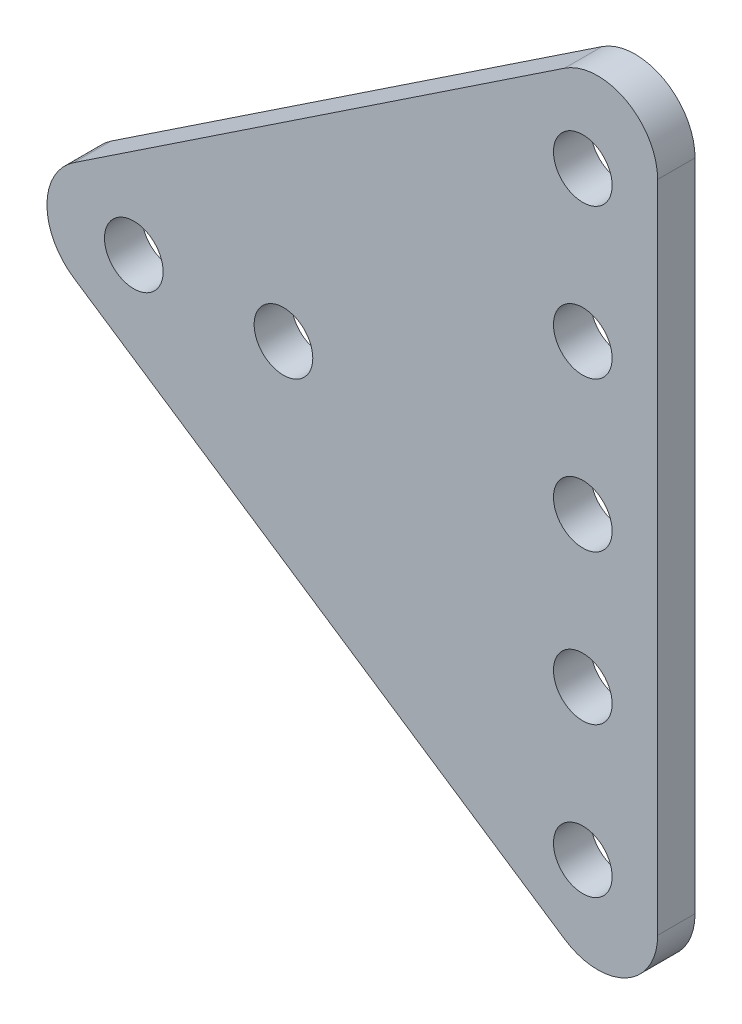
ISO-10303-21;
HEADER;
FILE_DESCRIPTION(('STEP AP214'),'2;1');
FILE_NAME('part.step','',(''),(''),'','','');
FILE_SCHEMA(('AUTOMOTIVE_DESIGN { 1 0 10303 214 1 1 1 1 }'));
ENDSEC;
DATA;
#1=APPLICATION_CONTEXT('core data for automotive mechanical design processes');
#2=APPLICATION_PROTOCOL_DEFINITION('international standard','automotive_design',2000,#1);
#3=PRODUCT_CONTEXT('',#1,'mechanical');
#4=PRODUCT('Part','Part','',(#3));
#5=PRODUCT_RELATED_PRODUCT_CATEGORY('part','',(#4));
#6=PRODUCT_DEFINITION_FORMATION('','',#4);
#7=PRODUCT_DEFINITION_CONTEXT('part definition',#1,'design');
#8=PRODUCT_DEFINITION('design','',#6,#7);
#9=PRODUCT_DEFINITION_SHAPE('','',#8);
#10=(LENGTH_UNIT() NAMED_UNIT(*) SI_UNIT(.MILLI.,.METRE.));
#11=(NAMED_UNIT(*) PLANE_ANGLE_UNIT() SI_UNIT($,.RADIAN.));
#12=(NAMED_UNIT(*) SI_UNIT($,.STERADIAN.) SOLID_ANGLE_UNIT());
#13=UNCERTAINTY_MEASURE_WITH_UNIT(LENGTH_MEASURE(1.E-05),#10,'distance_accuracy_value','');
#14=(GEOMETRIC_REPRESENTATION_CONTEXT(3) GLOBAL_UNCERTAINTY_ASSIGNED_CONTEXT((#13)) GLOBAL_UNIT_ASSIGNED_CONTEXT((#10,
#11,#12)) REPRESENTATION_CONTEXT('',''));
#15=CARTESIAN_POINT('',(0.,0.,0.));
#16=DIRECTION('',(0.,0.,1.));
#17=DIRECTION('',(1.,0.,0.));
#18=AXIS2_PLACEMENT_3D('',#15,#16,#17);
#19=CARTESIAN_POINT('',(336.55,-114.3,123.825));
#20=DIRECTION('',(1.,0.,0.));
#21=DIRECTION('',(0.,0.,-1.));
#22=AXIS2_PLACEMENT_3D('',#19,#20,#21);
#23=PLANE('',#22);
#24=DIRECTION('',(0.,-1.,0.));
#25=VECTOR('',#24,1.);
#26=CARTESIAN_POINT('',(336.55,-114.3,123.825));
#27=LINE('',#26,#25);
#28=CARTESIAN_POINT('',(336.55,-86.5269829206469,123.825));
#29=VERTEX_POINT('',#28);
#30=CARTESIAN_POINT('',(336.55,-142.073017079353,123.825));
#31=VERTEX_POINT('',#30);
#32=EDGE_CURVE('E96',#29,#31,#27,.T.);
#33=ORIENTED_EDGE('',*,*,#32,.T.);
#34=DIRECTION('',(0.,0.,-1.));
#35=VECTOR('',#34,1.);
#36=CARTESIAN_POINT('',(336.55,-142.073017079353,120.65));
#37=LINE('',#36,#35);
#38=CARTESIAN_POINT('',(336.55,-142.073017079353,120.65));
#39=VERTEX_POINT('',#38);
#40=EDGE_CURVE('E108',#31,#39,#37,.T.);
#41=ORIENTED_EDGE('',*,*,#40,.T.);
#42=DIRECTION('',(0.,-1.,0.));
#43=VECTOR('',#42,1.);
#44=CARTESIAN_POINT('',(336.55,-114.3,120.65));
#45=LINE('',#44,#43);
#46=CARTESIAN_POINT('',(336.55,-86.5269829206469,120.65));
#47=VERTEX_POINT('',#46);
#48=EDGE_CURVE('E90',#47,#39,#45,.T.);
#49=ORIENTED_EDGE('',*,*,#48,.F.);
#50=DIRECTION('',(0.,0.,-1.));
#51=VECTOR('',#50,1.);
#52=CARTESIAN_POINT('',(336.55,-86.5269829206469,123.825));
#53=LINE('',#52,#51);
#54=EDGE_CURVE('E76',#47,#29,#53,.F.);
#55=ORIENTED_EDGE('',*,*,#54,.T.);
#56=EDGE_LOOP('',(#33,#41,#49,#55));
#57=FACE_BOUND('',#56,.T.);
#58=ADVANCED_FACE('F17',(#57),#23,.T.);
#59=CARTESIAN_POINT('',(308.6011875,-95.667458,123.825));
#60=DIRECTION('',(0.554700203095346,-0.832050289757766,0.));
#61=DIRECTION('',(0.832050289757766,0.554700203095346,0.));
#62=AXIS2_PLACEMENT_3D('',#59,#60,#61);
#63=PLANE('',#62);
#64=DIRECTION('',(-0.832050289757766,-0.554700203095346,0.));
#65=VECTOR('',#64,1.);
#66=CARTESIAN_POINT('',(308.6011875,-95.667458,120.65));
#67=LINE('',#66,#65);
#68=CARTESIAN_POINT('',(328.652122968276,-82.3001674486775,120.65));
#69=VERTEX_POINT('',#68);
#70=CARTESIAN_POINT('',(286.992598094528,-110.07318452803,120.65));
#71=VERTEX_POINT('',#70);
#72=EDGE_CURVE('E82',#69,#71,#67,.T.);
#73=ORIENTED_EDGE('',*,*,#72,.T.);
#74=DIRECTION('',(0.,0.,-1.));
#75=VECTOR('',#74,1.);
#76=CARTESIAN_POINT('',(286.992598094528,-110.07318452803,123.825));
#77=LINE('',#76,#75);
#78=CARTESIAN_POINT('',(286.992598094528,-110.07318452803,123.825));
#79=VERTEX_POINT('',#78);
#80=EDGE_CURVE('E26',#71,#79,#77,.F.);
#81=ORIENTED_EDGE('',*,*,#80,.T.);
#82=DIRECTION('',(-0.832050289757766,-0.554700203095346,0.));
#83=VECTOR('',#82,1.);
#84=CARTESIAN_POINT('',(308.6011875,-95.667458,123.825));
#85=LINE('',#84,#83);
#86=CARTESIAN_POINT('',(328.652122968276,-82.3001674486775,123.825));
#87=VERTEX_POINT('',#86);
#88=EDGE_CURVE('E83',#87,#79,#85,.T.);
#89=ORIENTED_EDGE('',*,*,#88,.F.);
#90=DIRECTION('',(0.,0.,-1.));
#91=VECTOR('',#90,1.);
#92=CARTESIAN_POINT('',(328.652122968276,-82.3001674486775,120.65));
#93=LINE('',#92,#91);
#94=EDGE_CURVE('E75',#87,#69,#93,.T.);
#95=ORIENTED_EDGE('',*,*,#94,.T.);
#96=EDGE_LOOP('',(#73,#81,#89,#95));
#97=FACE_BOUND('',#96,.T.);
#98=ADVANCED_FACE('F81',(#97),#63,.F.);
#99=CARTESIAN_POINT('',(308.6011875,-132.932542,123.825));
#100=DIRECTION('',(0.554700203095346,0.832050289757766,0.));
#101=DIRECTION('',(-0.832050289757766,0.554700203095346,0.));
#102=AXIS2_PLACEMENT_3D('',#99,#100,#101);
#103=PLANE('',#102);
#104=DIRECTION('',(0.832050289757766,-0.554700203095346,0.));
#105=VECTOR('',#104,1.);
#106=CARTESIAN_POINT('',(308.6011875,-132.932542,123.825));
#107=LINE('',#106,#105);
#108=CARTESIAN_POINT('',(286.992598094528,-118.526815471969,123.825));
#109=VERTEX_POINT('',#108);
#110=CARTESIAN_POINT('',(328.652122968276,-146.299832551322,123.825));
#111=VERTEX_POINT('',#110);
#112=EDGE_CURVE('E85',#109,#111,#107,.T.);
#113=ORIENTED_EDGE('',*,*,#112,.F.);
#114=DIRECTION('',(0.,0.,-1.));
#115=VECTOR('',#114,1.);
#116=CARTESIAN_POINT('',(286.992598094528,-118.526815471969,123.825));
#117=LINE('',#116,#115);
#118=CARTESIAN_POINT('',(286.992598094528,-118.526815471969,120.65));
#119=VERTEX_POINT('',#118);
#120=EDGE_CURVE('E122',#109,#119,#117,.T.);
#121=ORIENTED_EDGE('',*,*,#120,.T.);
#122=DIRECTION('',(0.832050289757766,-0.554700203095346,0.));
#123=VECTOR('',#122,1.);
#124=CARTESIAN_POINT('',(308.6011875,-132.932542,120.65));
#125=LINE('',#124,#123);
#126=CARTESIAN_POINT('',(328.652122968276,-146.299832551322,120.65));
#127=VERTEX_POINT('',#126);
#128=EDGE_CURVE('E89',#119,#127,#125,.T.);
#129=ORIENTED_EDGE('',*,*,#128,.T.);
#130=DIRECTION('',(0.,0.,-1.));
#131=VECTOR('',#130,1.);
#132=CARTESIAN_POINT('',(328.652122968276,-146.299832551322,123.825));
#133=LINE('',#132,#131);
#134=EDGE_CURVE('E115',#127,#111,#133,.F.);
#135=ORIENTED_EDGE('',*,*,#134,.T.);
#136=EDGE_LOOP('',(#113,#121,#129,#135));
#137=FACE_BOUND('',#136,.T.);
#138=ADVANCED_FACE('F188',(#137),#103,.F.);
#139=CARTESIAN_POINT('',(308.6011875,-114.3,123.825));
#140=DIRECTION('',(0.,0.,1.));
#141=DIRECTION('',(1.,0.,0.));
#142=AXIS2_PLACEMENT_3D('',#139,#140,#141);
#143=PLANE('',#142);
#144=CARTESIAN_POINT('',(292.1,-114.3,123.825));
#145=DIRECTION('',(0.,0.,1.));
#146=DIRECTION('',(1.,0.,0.));
#147=AXIS2_PLACEMENT_3D('',#144,#145,#146);
#148=CIRCLE('',#147,2.48920000000003);
#149=CARTESIAN_POINT('',(294.5892,-114.3,123.825));
#150=VERTEX_POINT('',#149);
#151=EDGE_CURVE('E99',#150,#150,#148,.T.);
#152=ORIENTED_EDGE('',*,*,#151,.F.);
#153=EDGE_LOOP('',(#152));
#154=FACE_BOUND('',#153,.T.);
#155=CARTESIAN_POINT('',(330.2,-114.3,123.825));
#156=DIRECTION('',(0.,0.,1.));
#157=DIRECTION('',(1.,0.,0.));
#158=AXIS2_PLACEMENT_3D('',#155,#156,#157);
#159=CIRCLE('',#158,2.48920000000003);
#160=CARTESIAN_POINT('',(332.6892,-114.3,123.825));
#161=VERTEX_POINT('',#160);
#162=EDGE_CURVE('E143',#161,#161,#159,.T.);
#163=ORIENTED_EDGE('',*,*,#162,.F.);
#164=EDGE_LOOP('',(#163));
#165=FACE_BOUND('',#164,.T.);
#166=CARTESIAN_POINT('',(330.2,-127.,123.825));
#167=DIRECTION('',(0.,0.,1.));
#168=DIRECTION('',(1.,0.,0.));
#169=AXIS2_PLACEMENT_3D('',#166,#167,#168);
#170=CIRCLE('',#169,2.48920000000003);
#171=CARTESIAN_POINT('',(332.6892,-127.,123.825));
#172=VERTEX_POINT('',#171);
#173=EDGE_CURVE('E138',#172,#172,#170,.T.);
#174=ORIENTED_EDGE('',*,*,#173,.F.);
#175=EDGE_LOOP('',(#174));
#176=FACE_BOUND('',#175,.T.);
#177=CARTESIAN_POINT('',(330.2,-139.7,123.825));
#178=DIRECTION('',(0.,0.,1.));
#179=DIRECTION('',(1.,0.,0.));
#180=AXIS2_PLACEMENT_3D('',#177,#178,#179);
#181=CIRCLE('',#180,2.48920000000003);
#182=CARTESIAN_POINT('',(332.6892,-139.7,123.825));
#183=VERTEX_POINT('',#182);
#184=EDGE_CURVE('E137',#183,#183,#181,.T.);
#185=ORIENTED_EDGE('',*,*,#184,.F.);
#186=EDGE_LOOP('',(#185));
#187=FACE_BOUND('',#186,.T.);
#188=CARTESIAN_POINT('',(304.8,-114.3,123.825));
#189=DIRECTION('',(0.,0.,1.));
#190=DIRECTION('',(1.,0.,0.));
#191=AXIS2_PLACEMENT_3D('',#188,#189,#190);
#192=CIRCLE('',#191,2.48920000000003);
#193=CARTESIAN_POINT('',(307.2892,-114.3,123.825));
#194=VERTEX_POINT('',#193);
#195=EDGE_CURVE('E148',#194,#194,#192,.T.);
#196=ORIENTED_EDGE('',*,*,#195,.F.);
#197=EDGE_LOOP('',(#196));
#198=FACE_BOUND('',#197,.T.);
#199=CARTESIAN_POINT('',(330.2,-101.6,123.825));
#200=DIRECTION('',(0.,0.,1.));
#201=DIRECTION('',(1.,0.,0.));
#202=AXIS2_PLACEMENT_3D('',#199,#200,#201);
#203=CIRCLE('',#202,2.48920000000003);
#204=CARTESIAN_POINT('',(332.6892,-101.6,123.825));
#205=VERTEX_POINT('',#204);
#206=EDGE_CURVE('E163',#205,#205,#203,.T.);
#207=ORIENTED_EDGE('',*,*,#206,.F.);
#208=EDGE_LOOP('',(#207));
#209=FACE_BOUND('',#208,.T.);
#210=CARTESIAN_POINT('',(330.2,-88.9,123.825));
#211=DIRECTION('',(0.,0.,1.));
#212=DIRECTION('',(1.,0.,0.));
#213=AXIS2_PLACEMENT_3D('',#210,#211,#212);
#214=CIRCLE('',#213,2.48920000000003);
#215=CARTESIAN_POINT('',(332.6892,-88.9,123.825));
#216=VERTEX_POINT('',#215);
#217=EDGE_CURVE('E170',#216,#216,#214,.T.);
#218=ORIENTED_EDGE('',*,*,#217,.F.);
#219=EDGE_LOOP('',(#218));
#220=FACE_BOUND('',#219,.T.);
#221=ORIENTED_EDGE('',*,*,#88,.T.);
#222=CARTESIAN_POINT('',(289.810475126253,-114.3,123.825));
#223=DIRECTION('',(0.,0.,1.));
#224=DIRECTION('',(1.,0.,0.));
#225=AXIS2_PLACEMENT_3D('',#222,#223,#224);
#226=CIRCLE('',#225,5.08);
#227=EDGE_CURVE('E11',#79,#109,#226,.T.);
#228=ORIENTED_EDGE('',*,*,#227,.T.);
#229=ORIENTED_EDGE('',*,*,#112,.T.);
#230=CARTESIAN_POINT('',(331.47,-142.073017079353,123.825));
#231=DIRECTION('',(0.,0.,1.));
#232=DIRECTION('',(1.,0.,0.));
#233=AXIS2_PLACEMENT_3D('',#230,#231,#232);
#234=CIRCLE('',#233,5.08);
#235=EDGE_CURVE('E119',#111,#31,#234,.T.);
#236=ORIENTED_EDGE('',*,*,#235,.T.);
#237=ORIENTED_EDGE('',*,*,#32,.F.);
#238=CARTESIAN_POINT('',(331.47,-86.5269829206469,123.825));
#239=DIRECTION('',(0.,0.,1.));
#240=DIRECTION('',(1.,0.,0.));
#241=AXIS2_PLACEMENT_3D('',#238,#239,#240);
#242=CIRCLE('',#241,5.08);
#243=EDGE_CURVE('E105',#29,#87,#242,.T.);
#244=ORIENTED_EDGE('',*,*,#243,.T.);
#245=EDGE_LOOP('',(#221,#228,#229,#236,#237,#244));
#246=FACE_BOUND('',#245,.T.);
#247=ADVANCED_FACE('F181',(#154,#165,#176,#187,#198,#209,#220,#246),#143,.T.);
#248=CARTESIAN_POINT('',(308.6011875,-114.3,120.65));
#249=DIRECTION('',(0.,0.,1.));
#250=DIRECTION('',(1.,0.,0.));
#251=AXIS2_PLACEMENT_3D('',#248,#249,#250);
#252=PLANE('',#251);
#253=CARTESIAN_POINT('',(292.1,-114.3,120.65));
#254=DIRECTION('',(0.,0.,1.));
#255=DIRECTION('',(1.,0.,0.));
#256=AXIS2_PLACEMENT_3D('',#253,#254,#255);
#257=CIRCLE('',#256,2.48920000000003);
#258=CARTESIAN_POINT('',(294.5892,-114.3,120.65));
#259=VERTEX_POINT('',#258);
#260=EDGE_CURVE('E151',#259,#259,#257,.T.);
#261=ORIENTED_EDGE('',*,*,#260,.T.);
#262=EDGE_LOOP('',(#261));
#263=FACE_BOUND('',#262,.T.);
#264=CARTESIAN_POINT('',(330.2,-114.3,120.65));
#265=DIRECTION('',(0.,0.,1.));
#266=DIRECTION('',(1.,0.,0.));
#267=AXIS2_PLACEMENT_3D('',#264,#265,#266);
#268=CIRCLE('',#267,2.48920000000003);
#269=CARTESIAN_POINT('',(332.6892,-114.3,120.65));
#270=VERTEX_POINT('',#269);
#271=EDGE_CURVE('E167',#270,#270,#268,.T.);
#272=ORIENTED_EDGE('',*,*,#271,.T.);
#273=EDGE_LOOP('',(#272));
#274=FACE_BOUND('',#273,.T.);
#275=CARTESIAN_POINT('',(330.2,-127.,120.65));
#276=DIRECTION('',(0.,0.,1.));
#277=DIRECTION('',(1.,0.,0.));
#278=AXIS2_PLACEMENT_3D('',#275,#276,#277);
#279=CIRCLE('',#278,2.48920000000003);
#280=CARTESIAN_POINT('',(332.6892,-127.,120.65));
#281=VERTEX_POINT('',#280);
#282=EDGE_CURVE('E140',#281,#281,#279,.T.);
#283=ORIENTED_EDGE('',*,*,#282,.T.);
#284=EDGE_LOOP('',(#283));
#285=FACE_BOUND('',#284,.T.);
#286=CARTESIAN_POINT('',(330.2,-139.7,120.65));
#287=DIRECTION('',(0.,0.,1.));
#288=DIRECTION('',(1.,0.,0.));
#289=AXIS2_PLACEMENT_3D('',#286,#287,#288);
#290=CIRCLE('',#289,2.48920000000003);
#291=CARTESIAN_POINT('',(332.6892,-139.7,120.65));
#292=VERTEX_POINT('',#291);
#293=EDGE_CURVE('E134',#292,#292,#290,.T.);
#294=ORIENTED_EDGE('',*,*,#293,.T.);
#295=EDGE_LOOP('',(#294));
#296=FACE_BOUND('',#295,.T.);
#297=CARTESIAN_POINT('',(304.8,-114.3,120.65));
#298=DIRECTION('',(0.,0.,1.));
#299=DIRECTION('',(1.,0.,0.));
#300=AXIS2_PLACEMENT_3D('',#297,#298,#299);
#301=CIRCLE('',#300,2.48920000000003);
#302=CARTESIAN_POINT('',(307.2892,-114.3,120.65));
#303=VERTEX_POINT('',#302);
#304=EDGE_CURVE('E152',#303,#303,#301,.T.);
#305=ORIENTED_EDGE('',*,*,#304,.T.);
#306=EDGE_LOOP('',(#305));
#307=FACE_BOUND('',#306,.T.);
#308=CARTESIAN_POINT('',(330.2,-101.6,120.65));
#309=DIRECTION('',(0.,0.,1.));
#310=DIRECTION('',(1.,0.,0.));
#311=AXIS2_PLACEMENT_3D('',#308,#309,#310);
#312=CIRCLE('',#311,2.48920000000003);
#313=CARTESIAN_POINT('',(332.6892,-101.6,120.65));
#314=VERTEX_POINT('',#313);
#315=EDGE_CURVE('E132',#314,#314,#312,.T.);
#316=ORIENTED_EDGE('',*,*,#315,.T.);
#317=EDGE_LOOP('',(#316));
#318=FACE_BOUND('',#317,.T.);
#319=CARTESIAN_POINT('',(330.2,-88.9,120.65));
#320=DIRECTION('',(0.,0.,1.));
#321=DIRECTION('',(1.,0.,0.));
#322=AXIS2_PLACEMENT_3D('',#319,#320,#321);
#323=CIRCLE('',#322,2.48920000000003);
#324=CARTESIAN_POINT('',(332.6892,-88.9,120.65));
#325=VERTEX_POINT('',#324);
#326=EDGE_CURVE('E174',#325,#325,#323,.T.);
#327=ORIENTED_EDGE('',*,*,#326,.T.);
#328=EDGE_LOOP('',(#327));
#329=FACE_BOUND('',#328,.T.);
#330=ORIENTED_EDGE('',*,*,#128,.F.);
#331=CARTESIAN_POINT('',(289.810475126253,-114.3,120.65));
#332=DIRECTION('',(0.,0.,1.));
#333=DIRECTION('',(1.,0.,0.));
#334=AXIS2_PLACEMENT_3D('',#331,#332,#333);
#335=CIRCLE('',#334,5.08);
#336=EDGE_CURVE('E40',#119,#71,#335,.F.);
#337=ORIENTED_EDGE('',*,*,#336,.T.);
#338=ORIENTED_EDGE('',*,*,#72,.F.);
#339=CARTESIAN_POINT('',(331.47,-86.5269829206469,120.65));
#340=DIRECTION('',(0.,0.,1.));
#341=DIRECTION('',(1.,0.,0.));
#342=AXIS2_PLACEMENT_3D('',#339,#340,#341);
#343=CIRCLE('',#342,5.08);
#344=EDGE_CURVE('E71',#69,#47,#343,.F.);
#345=ORIENTED_EDGE('',*,*,#344,.T.);
#346=ORIENTED_EDGE('',*,*,#48,.T.);
#347=CARTESIAN_POINT('',(331.47,-142.073017079353,120.65));
#348=DIRECTION('',(0.,0.,1.));
#349=DIRECTION('',(1.,0.,0.));
#350=AXIS2_PLACEMENT_3D('',#347,#348,#349);
#351=CIRCLE('',#350,5.08);
#352=EDGE_CURVE('E111',#39,#127,#351,.F.);
#353=ORIENTED_EDGE('',*,*,#352,.T.);
#354=EDGE_LOOP('',(#330,#337,#338,#345,#346,#353));
#355=FACE_BOUND('',#354,.T.);
#356=ADVANCED_FACE('F87',(#263,#274,#285,#296,#307,#318,#329,#355),#252,.F.);
#357=CARTESIAN_POINT('',(330.2,-88.9,123.825));
#358=DIRECTION('',(0.,0.,-1.));
#359=DIRECTION('',(-1.,0.,0.));
#360=AXIS2_PLACEMENT_3D('',#357,#358,#359);
#361=CYLINDRICAL_SURFACE('',#360,2.48920000000003);
#362=ORIENTED_EDGE('',*,*,#217,.T.);
#363=EDGE_LOOP('',(#362));
#364=FACE_BOUND('',#363,.T.);
#365=ORIENTED_EDGE('',*,*,#326,.F.);
#366=EDGE_LOOP('',(#365));
#367=FACE_BOUND('',#366,.T.);
#368=ADVANCED_FACE('F234',(#364,#367),#361,.F.);
#369=CARTESIAN_POINT('',(330.2,-101.6,123.825));
#370=DIRECTION('',(0.,0.,-1.));
#371=DIRECTION('',(-1.,0.,0.));
#372=AXIS2_PLACEMENT_3D('',#369,#370,#371);
#373=CYLINDRICAL_SURFACE('',#372,2.48920000000003);
#374=ORIENTED_EDGE('',*,*,#206,.T.);
#375=EDGE_LOOP('',(#374));
#376=FACE_BOUND('',#375,.T.);
#377=ORIENTED_EDGE('',*,*,#315,.F.);
#378=EDGE_LOOP('',(#377));
#379=FACE_BOUND('',#378,.T.);
#380=ADVANCED_FACE('F227',(#376,#379),#373,.F.);
#381=CARTESIAN_POINT('',(304.8,-114.3,123.825));
#382=DIRECTION('',(0.,0.,-1.));
#383=DIRECTION('',(-1.,0.,0.));
#384=AXIS2_PLACEMENT_3D('',#381,#382,#383);
#385=CYLINDRICAL_SURFACE('',#384,2.48920000000003);
#386=ORIENTED_EDGE('',*,*,#195,.T.);
#387=EDGE_LOOP('',(#386));
#388=FACE_BOUND('',#387,.T.);
#389=ORIENTED_EDGE('',*,*,#304,.F.);
#390=EDGE_LOOP('',(#389));
#391=FACE_BOUND('',#390,.T.);
#392=ADVANCED_FACE('F224',(#388,#391),#385,.F.);
#393=CARTESIAN_POINT('',(330.2,-139.7,123.825));
#394=DIRECTION('',(0.,0.,-1.));
#395=DIRECTION('',(-1.,0.,0.));
#396=AXIS2_PLACEMENT_3D('',#393,#394,#395);
#397=CYLINDRICAL_SURFACE('',#396,2.48920000000003);
#398=ORIENTED_EDGE('',*,*,#184,.T.);
#399=EDGE_LOOP('',(#398));
#400=FACE_BOUND('',#399,.T.);
#401=ORIENTED_EDGE('',*,*,#293,.F.);
#402=EDGE_LOOP('',(#401));
#403=FACE_BOUND('',#402,.T.);
#404=ADVANCED_FACE('F221',(#400,#403),#397,.F.);
#405=CARTESIAN_POINT('',(330.2,-127.,123.825));
#406=DIRECTION('',(0.,0.,-1.));
#407=DIRECTION('',(-1.,0.,0.));
#408=AXIS2_PLACEMENT_3D('',#405,#406,#407);
#409=CYLINDRICAL_SURFACE('',#408,2.48920000000003);
#410=ORIENTED_EDGE('',*,*,#173,.T.);
#411=EDGE_LOOP('',(#410));
#412=FACE_BOUND('',#411,.T.);
#413=ORIENTED_EDGE('',*,*,#282,.F.);
#414=EDGE_LOOP('',(#413));
#415=FACE_BOUND('',#414,.T.);
#416=ADVANCED_FACE('F214',(#412,#415),#409,.F.);
#417=CARTESIAN_POINT('',(330.2,-114.3,123.825));
#418=DIRECTION('',(0.,0.,-1.));
#419=DIRECTION('',(-1.,0.,0.));
#420=AXIS2_PLACEMENT_3D('',#417,#418,#419);
#421=CYLINDRICAL_SURFACE('',#420,2.48920000000003);
#422=ORIENTED_EDGE('',*,*,#162,.T.);
#423=EDGE_LOOP('',(#422));
#424=FACE_BOUND('',#423,.T.);
#425=ORIENTED_EDGE('',*,*,#271,.F.);
#426=EDGE_LOOP('',(#425));
#427=FACE_BOUND('',#426,.T.);
#428=ADVANCED_FACE('F209',(#424,#427),#421,.F.);
#429=CARTESIAN_POINT('',(292.1,-114.3,123.825));
#430=DIRECTION('',(0.,0.,-1.));
#431=DIRECTION('',(-1.,0.,0.));
#432=AXIS2_PLACEMENT_3D('',#429,#430,#431);
#433=CYLINDRICAL_SURFACE('',#432,2.48920000000003);
#434=ORIENTED_EDGE('',*,*,#151,.T.);
#435=EDGE_LOOP('',(#434));
#436=FACE_BOUND('',#435,.T.);
#437=ORIENTED_EDGE('',*,*,#260,.F.);
#438=EDGE_LOOP('',(#437));
#439=FACE_BOUND('',#438,.T.);
#440=ADVANCED_FACE('F206',(#436,#439),#433,.F.);
#441=CARTESIAN_POINT('',(331.47,-86.5269829206469,123.825));
#442=DIRECTION('',(0.,0.,1.));
#443=DIRECTION('',(1.,0.,0.));
#444=AXIS2_PLACEMENT_3D('',#441,#442,#443);
#445=CYLINDRICAL_SURFACE('',#444,5.08);
#446=ORIENTED_EDGE('',*,*,#243,.F.);
#447=ORIENTED_EDGE('',*,*,#54,.F.);
#448=ORIENTED_EDGE('',*,*,#344,.F.);
#449=ORIENTED_EDGE('',*,*,#94,.F.);
#450=EDGE_LOOP('',(#446,#447,#448,#449));
#451=FACE_BOUND('',#450,.T.);
#452=ADVANCED_FACE('F74',(#451),#445,.T.);
#453=CARTESIAN_POINT('',(331.47,-142.073017079353,123.825));
#454=DIRECTION('',(0.,0.,1.));
#455=DIRECTION('',(1.,0.,0.));
#456=AXIS2_PLACEMENT_3D('',#453,#454,#455);
#457=CYLINDRICAL_SURFACE('',#456,5.08);
#458=ORIENTED_EDGE('',*,*,#235,.F.);
#459=ORIENTED_EDGE('',*,*,#134,.F.);
#460=ORIENTED_EDGE('',*,*,#352,.F.);
#461=ORIENTED_EDGE('',*,*,#40,.F.);
#462=EDGE_LOOP('',(#458,#459,#460,#461));
#463=FACE_BOUND('',#462,.T.);
#464=ADVANCED_FACE('F191',(#463),#457,.T.);
#465=CARTESIAN_POINT('',(289.810475126253,-114.3,123.825));
#466=DIRECTION('',(0.,0.,-1.));
#467=DIRECTION('',(-1.,0.,0.));
#468=AXIS2_PLACEMENT_3D('',#465,#466,#467);
#469=CYLINDRICAL_SURFACE('',#468,5.08);
#470=ORIENTED_EDGE('',*,*,#227,.F.);
#471=ORIENTED_EDGE('',*,*,#80,.F.);
#472=ORIENTED_EDGE('',*,*,#336,.F.);
#473=ORIENTED_EDGE('',*,*,#120,.F.);
#474=EDGE_LOOP('',(#470,#471,#472,#473));
#475=FACE_BOUND('',#474,.T.);
#476=ADVANCED_FACE('F19',(#475),#469,.T.);
#477=CLOSED_SHELL('',(#58,#98,#138,#247,#356,#368,#380,#392,#404,#416,#428,#440,#452,#464,#476));
#478=MANIFOLD_SOLID_BREP('B1',#477);
#479=ADVANCED_BREP_SHAPE_REPRESENTATION('',(#18,#478),#14);
#480=SHAPE_DEFINITION_REPRESENTATION(#9,#479);
ENDSEC;
END-ISO-10303-21;
